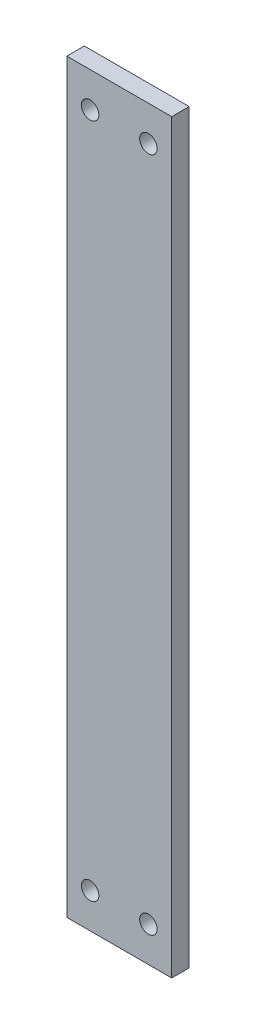
ISO-10303-21;
HEADER;
FILE_DESCRIPTION(('STEP AP214'),'2;1');
FILE_NAME('part.step','',(''),(''),'','','');
FILE_SCHEMA(('AUTOMOTIVE_DESIGN { 1 0 10303 214 1 1 1 1 }'));
ENDSEC;
DATA;
#1=APPLICATION_CONTEXT('core data for automotive mechanical design processes');
#2=APPLICATION_PROTOCOL_DEFINITION('international standard','automotive_design',2000,#1);
#3=PRODUCT_CONTEXT('',#1,'mechanical');
#4=PRODUCT('Part','Part','',(#3));
#5=PRODUCT_RELATED_PRODUCT_CATEGORY('part','',(#4));
#6=PRODUCT_DEFINITION_FORMATION('','',#4);
#7=PRODUCT_DEFINITION_CONTEXT('part definition',#1,'design');
#8=PRODUCT_DEFINITION('design','',#6,#7);
#9=PRODUCT_DEFINITION_SHAPE('','',#8);
#10=(LENGTH_UNIT() NAMED_UNIT(*) SI_UNIT(.MILLI.,.METRE.));
#11=(NAMED_UNIT(*) PLANE_ANGLE_UNIT() SI_UNIT($,.RADIAN.));
#12=(NAMED_UNIT(*) SI_UNIT($,.STERADIAN.) SOLID_ANGLE_UNIT());
#13=UNCERTAINTY_MEASURE_WITH_UNIT(LENGTH_MEASURE(1.E-05),#10,'distance_accuracy_value','');
#14=(GEOMETRIC_REPRESENTATION_CONTEXT(3) GLOBAL_UNCERTAINTY_ASSIGNED_CONTEXT((#13)) GLOBAL_UNIT_ASSIGNED_CONTEXT((#10,
#11,#12)) REPRESENTATION_CONTEXT('',''));
#15=CARTESIAN_POINT('',(0.,0.,0.));
#16=DIRECTION('',(0.,0.,1.));
#17=DIRECTION('',(1.,0.,0.));
#18=AXIS2_PLACEMENT_3D('',#15,#16,#17);
#19=CARTESIAN_POINT('',(0.,0.,3.));
#20=DIRECTION('',(0.,0.,-1.));
#21=DIRECTION('',(-1.,0.,0.));
#22=AXIS2_PLACEMENT_3D('',#19,#20,#21);
#23=PLANE('',#22);
#24=DIRECTION('',(0.,-1.,0.));
#25=VECTOR('',#24,1.);
#26=CARTESIAN_POINT('',(0.,0.,3.));
#27=LINE('',#26,#25);
#28=CARTESIAN_POINT('',(0.,128.,3.));
#29=VERTEX_POINT('',#28);
#30=CARTESIAN_POINT('',(0.,0.,3.));
#31=VERTEX_POINT('',#30);
#32=EDGE_CURVE('E84',#29,#31,#27,.T.);
#33=ORIENTED_EDGE('',*,*,#32,.T.);
#34=DIRECTION('',(1.,0.,0.));
#35=VECTOR('',#34,1.);
#36=CARTESIAN_POINT('',(0.,0.,3.));
#37=LINE('',#36,#35);
#38=CARTESIAN_POINT('',(18.,0.,3.));
#39=VERTEX_POINT('',#38);
#40=EDGE_CURVE('E79',#31,#39,#37,.T.);
#41=ORIENTED_EDGE('',*,*,#40,.T.);
#42=DIRECTION('',(0.,1.,0.));
#43=VECTOR('',#42,1.);
#44=CARTESIAN_POINT('',(18.,0.,3.));
#45=LINE('',#44,#43);
#46=CARTESIAN_POINT('',(18.,128.,3.));
#47=VERTEX_POINT('',#46);
#48=EDGE_CURVE('E82',#39,#47,#45,.T.);
#49=ORIENTED_EDGE('',*,*,#48,.T.);
#50=DIRECTION('',(-1.,0.,0.));
#51=VECTOR('',#50,1.);
#52=CARTESIAN_POINT('',(0.,128.,3.));
#53=LINE('',#52,#51);
#54=EDGE_CURVE('E49',#47,#29,#53,.T.);
#55=ORIENTED_EDGE('',*,*,#54,.T.);
#56=EDGE_LOOP('',(#33,#41,#49,#55));
#57=FACE_BOUND('',#56,.T.);
#58=CARTESIAN_POINT('',(4.,6.,3.));
#59=DIRECTION('',(0.,0.,1.));
#60=DIRECTION('',(1.,0.,0.));
#61=AXIS2_PLACEMENT_3D('',#58,#59,#60);
#62=CIRCLE('',#61,1.5);
#63=CARTESIAN_POINT('',(5.5,6.,3.));
#64=VERTEX_POINT('',#63);
#65=EDGE_CURVE('E99',#64,#64,#62,.T.);
#66=ORIENTED_EDGE('',*,*,#65,.F.);
#67=EDGE_LOOP('',(#66));
#68=FACE_BOUND('',#67,.T.);
#69=CARTESIAN_POINT('',(14.,6.,3.));
#70=DIRECTION('',(0.,0.,1.));
#71=DIRECTION('',(1.,0.,0.));
#72=AXIS2_PLACEMENT_3D('',#69,#70,#71);
#73=CIRCLE('',#72,1.5);
#74=CARTESIAN_POINT('',(15.5,6.,3.));
#75=VERTEX_POINT('',#74);
#76=EDGE_CURVE('E114',#75,#75,#73,.T.);
#77=ORIENTED_EDGE('',*,*,#76,.F.);
#78=EDGE_LOOP('',(#77));
#79=FACE_BOUND('',#78,.T.);
#80=CARTESIAN_POINT('',(3.99999999999999,122.,3.));
#81=DIRECTION('',(0.,0.,1.));
#82=DIRECTION('',(1.,0.,0.));
#83=AXIS2_PLACEMENT_3D('',#80,#81,#82);
#84=CIRCLE('',#83,1.5);
#85=CARTESIAN_POINT('',(5.49999999999999,122.,3.));
#86=VERTEX_POINT('',#85);
#87=EDGE_CURVE('E120',#86,#86,#84,.T.);
#88=ORIENTED_EDGE('',*,*,#87,.F.);
#89=EDGE_LOOP('',(#88));
#90=FACE_BOUND('',#89,.T.);
#91=CARTESIAN_POINT('',(14.,122.,3.));
#92=DIRECTION('',(0.,0.,1.));
#93=DIRECTION('',(1.,0.,0.));
#94=AXIS2_PLACEMENT_3D('',#91,#92,#93);
#95=CIRCLE('',#94,1.5);
#96=CARTESIAN_POINT('',(15.5,122.,3.));
#97=VERTEX_POINT('',#96);
#98=EDGE_CURVE('E126',#97,#97,#95,.T.);
#99=ORIENTED_EDGE('',*,*,#98,.F.);
#100=EDGE_LOOP('',(#99));
#101=FACE_BOUND('',#100,.T.);
#102=ADVANCED_FACE('F32',(#57,#68,#79,#90,#101),#23,.F.);
#103=CARTESIAN_POINT('',(0.,0.,0.));
#104=DIRECTION('',(0.,0.,-1.));
#105=DIRECTION('',(-1.,0.,0.));
#106=AXIS2_PLACEMENT_3D('',#103,#104,#105);
#107=PLANE('',#106);
#108=CARTESIAN_POINT('',(3.99999999999999,122.,0.));
#109=DIRECTION('',(0.,0.,1.));
#110=DIRECTION('',(1.,0.,0.));
#111=AXIS2_PLACEMENT_3D('',#108,#109,#110);
#112=CIRCLE('',#111,1.5);
#113=CARTESIAN_POINT('',(5.49999999999999,122.,0.));
#114=VERTEX_POINT('',#113);
#115=EDGE_CURVE('E123',#114,#114,#112,.T.);
#116=ORIENTED_EDGE('',*,*,#115,.T.);
#117=EDGE_LOOP('',(#116));
#118=FACE_BOUND('',#117,.T.);
#119=CARTESIAN_POINT('',(4.,6.,0.));
#120=DIRECTION('',(0.,0.,1.));
#121=DIRECTION('',(1.,0.,0.));
#122=AXIS2_PLACEMENT_3D('',#119,#120,#121);
#123=CIRCLE('',#122,1.5);
#124=CARTESIAN_POINT('',(5.5,6.,0.));
#125=VERTEX_POINT('',#124);
#126=EDGE_CURVE('E111',#125,#125,#123,.T.);
#127=ORIENTED_EDGE('',*,*,#126,.T.);
#128=EDGE_LOOP('',(#127));
#129=FACE_BOUND('',#128,.T.);
#130=DIRECTION('',(0.,-1.,0.));
#131=VECTOR('',#130,1.);
#132=CARTESIAN_POINT('',(0.,0.,0.));
#133=LINE('',#132,#131);
#134=CARTESIAN_POINT('',(0.,128.,0.));
#135=VERTEX_POINT('',#134);
#136=CARTESIAN_POINT('',(0.,0.,0.));
#137=VERTEX_POINT('',#136);
#138=EDGE_CURVE('E96',#135,#137,#133,.T.);
#139=ORIENTED_EDGE('',*,*,#138,.F.);
#140=DIRECTION('',(-1.,0.,0.));
#141=VECTOR('',#140,1.);
#142=CARTESIAN_POINT('',(0.,128.,0.));
#143=LINE('',#142,#141);
#144=CARTESIAN_POINT('',(18.,128.,0.));
#145=VERTEX_POINT('',#144);
#146=EDGE_CURVE('E72',#145,#135,#143,.T.);
#147=ORIENTED_EDGE('',*,*,#146,.F.);
#148=DIRECTION('',(0.,1.,0.));
#149=VECTOR('',#148,1.);
#150=CARTESIAN_POINT('',(18.,0.,0.));
#151=LINE('',#150,#149);
#152=CARTESIAN_POINT('',(18.,0.,0.));
#153=VERTEX_POINT('',#152);
#154=EDGE_CURVE('E66',#153,#145,#151,.T.);
#155=ORIENTED_EDGE('',*,*,#154,.F.);
#156=DIRECTION('',(1.,0.,0.));
#157=VECTOR('',#156,1.);
#158=CARTESIAN_POINT('',(0.,0.,0.));
#159=LINE('',#158,#157);
#160=EDGE_CURVE('E88',#137,#153,#159,.T.);
#161=ORIENTED_EDGE('',*,*,#160,.F.);
#162=EDGE_LOOP('',(#139,#147,#155,#161));
#163=FACE_BOUND('',#162,.T.);
#164=CARTESIAN_POINT('',(14.,6.,0.));
#165=DIRECTION('',(0.,0.,1.));
#166=DIRECTION('',(1.,0.,0.));
#167=AXIS2_PLACEMENT_3D('',#164,#165,#166);
#168=CIRCLE('',#167,1.5);
#169=CARTESIAN_POINT('',(15.5,6.,0.));
#170=VERTEX_POINT('',#169);
#171=EDGE_CURVE('E117',#170,#170,#168,.T.);
#172=ORIENTED_EDGE('',*,*,#171,.T.);
#173=EDGE_LOOP('',(#172));
#174=FACE_BOUND('',#173,.T.);
#175=CARTESIAN_POINT('',(14.,122.,0.));
#176=DIRECTION('',(0.,0.,1.));
#177=DIRECTION('',(1.,0.,0.));
#178=AXIS2_PLACEMENT_3D('',#175,#176,#177);
#179=CIRCLE('',#178,1.5);
#180=CARTESIAN_POINT('',(15.5,122.,0.));
#181=VERTEX_POINT('',#180);
#182=EDGE_CURVE('E129',#181,#181,#179,.T.);
#183=ORIENTED_EDGE('',*,*,#182,.T.);
#184=EDGE_LOOP('',(#183));
#185=FACE_BOUND('',#184,.T.);
#186=ADVANCED_FACE('F107',(#118,#129,#163,#174,#185),#107,.T.);
#187=CARTESIAN_POINT('',(0.,0.,3.));
#188=DIRECTION('',(1.,0.,0.));
#189=DIRECTION('',(0.,0.,-1.));
#190=AXIS2_PLACEMENT_3D('',#187,#188,#189);
#191=PLANE('',#190);
#192=ORIENTED_EDGE('',*,*,#138,.T.);
#193=DIRECTION('',(0.,0.,-1.));
#194=VECTOR('',#193,1.);
#195=CARTESIAN_POINT('',(0.,0.,3.));
#196=LINE('',#195,#194);
#197=EDGE_CURVE('E11',#31,#137,#196,.T.);
#198=ORIENTED_EDGE('',*,*,#197,.F.);
#199=ORIENTED_EDGE('',*,*,#32,.F.);
#200=DIRECTION('',(0.,0.,-1.));
#201=VECTOR('',#200,1.);
#202=CARTESIAN_POINT('',(0.,128.,3.));
#203=LINE('',#202,#201);
#204=EDGE_CURVE('E92',#29,#135,#203,.T.);
#205=ORIENTED_EDGE('',*,*,#204,.T.);
#206=EDGE_LOOP('',(#192,#198,#199,#205));
#207=FACE_BOUND('',#206,.T.);
#208=ADVANCED_FACE('F34',(#207),#191,.F.);
#209=CARTESIAN_POINT('',(0.,0.,3.));
#210=DIRECTION('',(0.,1.,0.));
#211=DIRECTION('',(0.,0.,1.));
#212=AXIS2_PLACEMENT_3D('',#209,#210,#211);
#213=PLANE('',#212);
#214=ORIENTED_EDGE('',*,*,#160,.T.);
#215=DIRECTION('',(0.,0.,-1.));
#216=VECTOR('',#215,1.);
#217=CARTESIAN_POINT('',(18.,0.,3.));
#218=LINE('',#217,#216);
#219=EDGE_CURVE('E41',#39,#153,#218,.T.);
#220=ORIENTED_EDGE('',*,*,#219,.F.);
#221=ORIENTED_EDGE('',*,*,#40,.F.);
#222=ORIENTED_EDGE('',*,*,#197,.T.);
#223=EDGE_LOOP('',(#214,#220,#221,#222));
#224=FACE_BOUND('',#223,.T.);
#225=ADVANCED_FACE('F87',(#224),#213,.F.);
#226=CARTESIAN_POINT('',(18.,0.,3.));
#227=DIRECTION('',(-1.,0.,0.));
#228=DIRECTION('',(0.,-1.,0.));
#229=AXIS2_PLACEMENT_3D('',#226,#227,#228);
#230=PLANE('',#229);
#231=ORIENTED_EDGE('',*,*,#154,.T.);
#232=DIRECTION('',(0.,0.,-1.));
#233=VECTOR('',#232,1.);
#234=CARTESIAN_POINT('',(18.,128.,3.));
#235=LINE('',#234,#233);
#236=EDGE_CURVE('E89',#47,#145,#235,.T.);
#237=ORIENTED_EDGE('',*,*,#236,.F.);
#238=ORIENTED_EDGE('',*,*,#48,.F.);
#239=ORIENTED_EDGE('',*,*,#219,.T.);
#240=EDGE_LOOP('',(#231,#237,#238,#239));
#241=FACE_BOUND('',#240,.T.);
#242=ADVANCED_FACE('F90',(#241),#230,.F.);
#243=CARTESIAN_POINT('',(0.,128.,3.));
#244=DIRECTION('',(0.,-1.,0.));
#245=DIRECTION('',(0.,0.,-1.));
#246=AXIS2_PLACEMENT_3D('',#243,#244,#245);
#247=PLANE('',#246);
#248=ORIENTED_EDGE('',*,*,#146,.T.);
#249=ORIENTED_EDGE('',*,*,#204,.F.);
#250=ORIENTED_EDGE('',*,*,#54,.F.);
#251=ORIENTED_EDGE('',*,*,#236,.T.);
#252=EDGE_LOOP('',(#248,#249,#250,#251));
#253=FACE_BOUND('',#252,.T.);
#254=ADVANCED_FACE('F104',(#253),#247,.F.);
#255=CARTESIAN_POINT('',(4.,6.,3.));
#256=DIRECTION('',(0.,0.,-1.));
#257=DIRECTION('',(-1.,0.,0.));
#258=AXIS2_PLACEMENT_3D('',#255,#256,#257);
#259=CYLINDRICAL_SURFACE('',#258,1.5);
#260=ORIENTED_EDGE('',*,*,#65,.T.);
#261=EDGE_LOOP('',(#260));
#262=FACE_BOUND('',#261,.T.);
#263=ORIENTED_EDGE('',*,*,#126,.F.);
#264=EDGE_LOOP('',(#263));
#265=FACE_BOUND('',#264,.T.);
#266=ADVANCED_FACE('F146',(#262,#265),#259,.F.);
#267=CARTESIAN_POINT('',(14.,6.,3.));
#268=DIRECTION('',(0.,0.,-1.));
#269=DIRECTION('',(-1.,0.,0.));
#270=AXIS2_PLACEMENT_3D('',#267,#268,#269);
#271=CYLINDRICAL_SURFACE('',#270,1.5);
#272=ORIENTED_EDGE('',*,*,#76,.T.);
#273=EDGE_LOOP('',(#272));
#274=FACE_BOUND('',#273,.T.);
#275=ORIENTED_EDGE('',*,*,#171,.F.);
#276=EDGE_LOOP('',(#275));
#277=FACE_BOUND('',#276,.T.);
#278=ADVANCED_FACE('F192',(#274,#277),#271,.F.);
#279=CARTESIAN_POINT('',(3.99999999999999,122.,3.));
#280=DIRECTION('',(0.,0.,-1.));
#281=DIRECTION('',(-1.,0.,0.));
#282=AXIS2_PLACEMENT_3D('',#279,#280,#281);
#283=CYLINDRICAL_SURFACE('',#282,1.5);
#284=ORIENTED_EDGE('',*,*,#87,.T.);
#285=EDGE_LOOP('',(#284));
#286=FACE_BOUND('',#285,.T.);
#287=ORIENTED_EDGE('',*,*,#115,.F.);
#288=EDGE_LOOP('',(#287));
#289=FACE_BOUND('',#288,.T.);
#290=ADVANCED_FACE('F200',(#286,#289),#283,.F.);
#291=CARTESIAN_POINT('',(14.,122.,3.));
#292=DIRECTION('',(0.,0.,-1.));
#293=DIRECTION('',(-1.,0.,0.));
#294=AXIS2_PLACEMENT_3D('',#291,#292,#293);
#295=CYLINDRICAL_SURFACE('',#294,1.5);
#296=ORIENTED_EDGE('',*,*,#98,.T.);
#297=EDGE_LOOP('',(#296));
#298=FACE_BOUND('',#297,.T.);
#299=ORIENTED_EDGE('',*,*,#182,.F.);
#300=EDGE_LOOP('',(#299));
#301=FACE_BOUND('',#300,.T.);
#302=ADVANCED_FACE('F135',(#298,#301),#295,.F.);
#303=CLOSED_SHELL('',(#102,#186,#208,#225,#242,#254,#266,#278,#290,#302));
#304=MANIFOLD_SOLID_BREP('B2',#303);
#305=ADVANCED_BREP_SHAPE_REPRESENTATION('',(#18,#304),#14);
#306=SHAPE_DEFINITION_REPRESENTATION(#9,#305);
ENDSEC;
END-ISO-10303-21;
